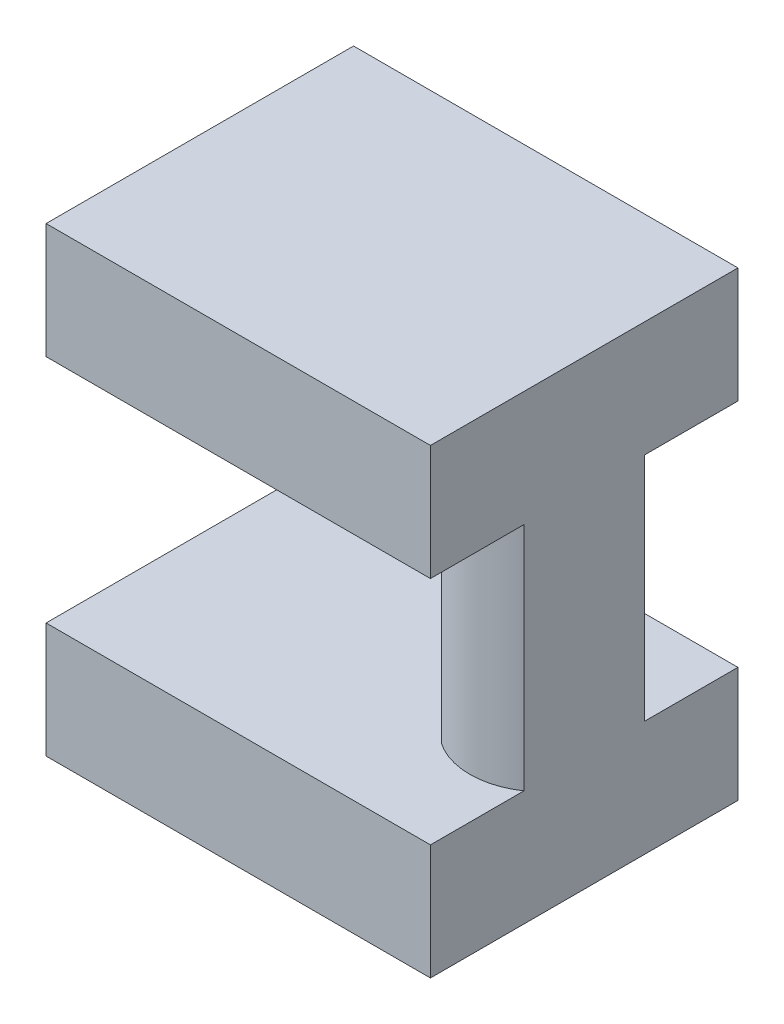
ISO-10303-21;
HEADER;
FILE_DESCRIPTION(('STEP AP214'),'2;1');
FILE_NAME('part.step','',(''),(''),'','','');
FILE_SCHEMA(('AUTOMOTIVE_DESIGN { 1 0 10303 214 1 1 1 1 }'));
ENDSEC;
DATA;
#1=APPLICATION_CONTEXT('core data for automotive mechanical design processes');
#2=APPLICATION_PROTOCOL_DEFINITION('international standard','automotive_design',2000,#1);
#3=PRODUCT_CONTEXT('',#1,'mechanical');
#4=PRODUCT('Part','Part','',(#3));
#5=PRODUCT_RELATED_PRODUCT_CATEGORY('part','',(#4));
#6=PRODUCT_DEFINITION_FORMATION('','',#4);
#7=PRODUCT_DEFINITION_CONTEXT('part definition',#1,'design');
#8=PRODUCT_DEFINITION('design','',#6,#7);
#9=PRODUCT_DEFINITION_SHAPE('','',#8);
#10=(LENGTH_UNIT() NAMED_UNIT(*) SI_UNIT(.MILLI.,.METRE.));
#11=(NAMED_UNIT(*) PLANE_ANGLE_UNIT() SI_UNIT($,.RADIAN.));
#12=(NAMED_UNIT(*) SI_UNIT($,.STERADIAN.) SOLID_ANGLE_UNIT());
#13=UNCERTAINTY_MEASURE_WITH_UNIT(LENGTH_MEASURE(1.E-05),#10,'distance_accuracy_value','');
#14=(GEOMETRIC_REPRESENTATION_CONTEXT(3) GLOBAL_UNCERTAINTY_ASSIGNED_CONTEXT((#13)) GLOBAL_UNIT_ASSIGNED_CONTEXT((#10,
#11,#12)) REPRESENTATION_CONTEXT('',''));
#15=CARTESIAN_POINT('',(0.,0.,0.));
#16=DIRECTION('',(0.,0.,1.));
#17=DIRECTION('',(1.,0.,0.));
#18=AXIS2_PLACEMENT_3D('',#15,#16,#17);
#19=CARTESIAN_POINT('',(0.,3.,0.));
#20=DIRECTION('',(0.,0.,-1.));
#21=DIRECTION('',(-1.,0.,0.));
#22=AXIS2_PLACEMENT_3D('',#19,#20,#21);
#23=PLANE('',#22);
#24=DIRECTION('',(-1.,0.,0.));
#25=VECTOR('',#24,1.);
#26=CARTESIAN_POINT('',(0.,3.,0.));
#27=LINE('',#26,#25);
#28=CARTESIAN_POINT('',(10.,3.,0.));
#29=VERTEX_POINT('',#28);
#30=CARTESIAN_POINT('',(0.,3.,0.));
#31=VERTEX_POINT('',#30);
#32=EDGE_CURVE('E118',#29,#31,#27,.T.);
#33=ORIENTED_EDGE('',*,*,#32,.F.);
#34=DIRECTION('',(0.,1.,0.));
#35=VECTOR('',#34,1.);
#36=CARTESIAN_POINT('',(10.,0.,0.));
#37=LINE('',#36,#35);
#38=CARTESIAN_POINT('',(10.,0.,0.));
#39=VERTEX_POINT('',#38);
#40=EDGE_CURVE('E172',#39,#29,#37,.T.);
#41=ORIENTED_EDGE('',*,*,#40,.F.);
#42=DIRECTION('',(1.,0.,0.));
#43=VECTOR('',#42,1.);
#44=CARTESIAN_POINT('',(0.,0.,0.));
#45=LINE('',#44,#43);
#46=CARTESIAN_POINT('',(0.,0.,0.));
#47=VERTEX_POINT('',#46);
#48=EDGE_CURVE('E168',#47,#39,#45,.T.);
#49=ORIENTED_EDGE('',*,*,#48,.F.);
#50=DIRECTION('',(0.,-1.,0.));
#51=VECTOR('',#50,1.);
#52=CARTESIAN_POINT('',(0.,0.,0.));
#53=LINE('',#52,#51);
#54=EDGE_CURVE('E165',#31,#47,#53,.T.);
#55=ORIENTED_EDGE('',*,*,#54,.F.);
#56=EDGE_LOOP('',(#33,#41,#49,#55));
#57=FACE_BOUND('',#56,.T.);
#58=ADVANCED_FACE('F69',(#57),#23,.T.);
#59=CARTESIAN_POINT('',(0.,3.,8.));
#60=DIRECTION('',(0.,0.,-1.));
#61=DIRECTION('',(-1.,0.,0.));
#62=AXIS2_PLACEMENT_3D('',#59,#60,#61);
#63=PLANE('',#62);
#64=DIRECTION('',(1.,0.,0.));
#65=VECTOR('',#64,1.);
#66=CARTESIAN_POINT('',(0.,9.,8.));
#67=LINE('',#66,#65);
#68=CARTESIAN_POINT('',(0.,9.,8.));
#69=VERTEX_POINT('',#68);
#70=CARTESIAN_POINT('',(10.,9.,8.));
#71=VERTEX_POINT('',#70);
#72=EDGE_CURVE('E158',#69,#71,#67,.T.);
#73=ORIENTED_EDGE('',*,*,#72,.T.);
#74=DIRECTION('',(0.,1.,0.));
#75=VECTOR('',#74,1.);
#76=CARTESIAN_POINT('',(10.,0.,8.));
#77=LINE('',#76,#75);
#78=CARTESIAN_POINT('',(10.,12.,8.));
#79=VERTEX_POINT('',#78);
#80=EDGE_CURVE('E143',#71,#79,#77,.T.);
#81=ORIENTED_EDGE('',*,*,#80,.T.);
#82=DIRECTION('',(-1.,0.,0.));
#83=VECTOR('',#82,1.);
#84=CARTESIAN_POINT('',(0.,12.,8.));
#85=LINE('',#84,#83);
#86=CARTESIAN_POINT('',(0.,12.,8.));
#87=VERTEX_POINT('',#86);
#88=EDGE_CURVE('E136',#79,#87,#85,.T.);
#89=ORIENTED_EDGE('',*,*,#88,.T.);
#90=DIRECTION('',(0.,-1.,0.));
#91=VECTOR('',#90,1.);
#92=CARTESIAN_POINT('',(0.,9.,8.));
#93=LINE('',#92,#91);
#94=EDGE_CURVE('E141',#87,#69,#93,.T.);
#95=ORIENTED_EDGE('',*,*,#94,.T.);
#96=EDGE_LOOP('',(#73,#81,#89,#95));
#97=FACE_BOUND('',#96,.T.);
#98=ADVANCED_FACE('F139',(#97),#63,.F.);
#99=CARTESIAN_POINT('',(0.,0.,8.));
#100=DIRECTION('',(1.,0.,0.));
#101=DIRECTION('',(0.,1.,0.));
#102=AXIS2_PLACEMENT_3D('',#99,#100,#101);
#103=PLANE('',#102);
#104=ORIENTED_EDGE('',*,*,#54,.T.);
#105=DIRECTION('',(0.,0.,-1.));
#106=VECTOR('',#105,1.);
#107=CARTESIAN_POINT('',(0.,0.,8.));
#108=LINE('',#107,#106);
#109=CARTESIAN_POINT('',(0.,0.,8.));
#110=VERTEX_POINT('',#109);
#111=EDGE_CURVE('E12',#110,#47,#108,.T.);
#112=ORIENTED_EDGE('',*,*,#111,.F.);
#113=DIRECTION('',(0.,-1.,0.));
#114=VECTOR('',#113,1.);
#115=CARTESIAN_POINT('',(0.,0.,8.));
#116=LINE('',#115,#114);
#117=CARTESIAN_POINT('',(0.,3.,8.));
#118=VERTEX_POINT('',#117);
#119=EDGE_CURVE('E181',#118,#110,#116,.T.);
#120=ORIENTED_EDGE('',*,*,#119,.F.);
#121=DIRECTION('',(0.,0.,-1.));
#122=VECTOR('',#121,1.);
#123=CARTESIAN_POINT('',(0.,3.,8.));
#124=LINE('',#123,#122);
#125=EDGE_CURVE('E164',#118,#31,#124,.T.);
#126=ORIENTED_EDGE('',*,*,#125,.T.);
#127=EDGE_LOOP('',(#104,#112,#120,#126));
#128=FACE_BOUND('',#127,.T.);
#129=ADVANCED_FACE('F71',(#128),#103,.F.);
#130=CARTESIAN_POINT('',(0.,0.,8.));
#131=DIRECTION('',(0.,1.,0.));
#132=DIRECTION('',(0.,0.,1.));
#133=AXIS2_PLACEMENT_3D('',#130,#131,#132);
#134=PLANE('',#133);
#135=ORIENTED_EDGE('',*,*,#48,.T.);
#136=DIRECTION('',(0.,0.,-1.));
#137=VECTOR('',#136,1.);
#138=CARTESIAN_POINT('',(10.,0.,8.));
#139=LINE('',#138,#137);
#140=CARTESIAN_POINT('',(10.,0.,8.));
#141=VERTEX_POINT('',#140);
#142=EDGE_CURVE('E78',#141,#39,#139,.T.);
#143=ORIENTED_EDGE('',*,*,#142,.F.);
#144=DIRECTION('',(1.,0.,0.));
#145=VECTOR('',#144,1.);
#146=CARTESIAN_POINT('',(0.,0.,8.));
#147=LINE('',#146,#145);
#148=EDGE_CURVE('E126',#110,#141,#147,.T.);
#149=ORIENTED_EDGE('',*,*,#148,.F.);
#150=ORIENTED_EDGE('',*,*,#111,.T.);
#151=EDGE_LOOP('',(#135,#143,#149,#150));
#152=FACE_BOUND('',#151,.T.);
#153=ADVANCED_FACE('F298',(#152),#134,.F.);
#154=CARTESIAN_POINT('',(10.,0.,8.));
#155=DIRECTION('',(-1.,0.,0.));
#156=DIRECTION('',(0.,0.,1.));
#157=AXIS2_PLACEMENT_3D('',#154,#155,#156);
#158=PLANE('',#157);
#159=DIRECTION('',(0.,0.,1.));
#160=VECTOR('',#159,1.);
#161=CARTESIAN_POINT('',(10.,9.,8.));
#162=LINE('',#161,#160);
#163=CARTESIAN_POINT('',(10.,9.,5.56664450338933));
#164=VERTEX_POINT('',#163);
#165=EDGE_CURVE('E169',#164,#71,#162,.T.);
#166=ORIENTED_EDGE('',*,*,#165,.F.);
#167=DIRECTION('',(0.,-1.,0.));
#168=VECTOR('',#167,1.);
#169=CARTESIAN_POINT('',(10.,10.1255002830389,5.56664450338933));
#170=LINE('',#169,#168);
#171=CARTESIAN_POINT('',(10.,3.,5.56664450338933));
#172=VERTEX_POINT('',#171);
#173=EDGE_CURVE('E248',#164,#172,#170,.T.);
#174=ORIENTED_EDGE('',*,*,#173,.T.);
#175=DIRECTION('',(0.,0.,-1.));
#176=VECTOR('',#175,1.);
#177=CARTESIAN_POINT('',(10.,3.,8.));
#178=LINE('',#177,#176);
#179=CARTESIAN_POINT('',(10.,3.,8.));
#180=VERTEX_POINT('',#179);
#181=EDGE_CURVE('E213',#180,#172,#178,.T.);
#182=ORIENTED_EDGE('',*,*,#181,.F.);
#183=EDGE_CURVE('E147',#141,#180,#77,.T.);
#184=ORIENTED_EDGE('',*,*,#183,.F.);
#185=ORIENTED_EDGE('',*,*,#142,.T.);
#186=ORIENTED_EDGE('',*,*,#40,.T.);
#187=DIRECTION('',(0.,0.,-1.));
#188=VECTOR('',#187,1.);
#189=CARTESIAN_POINT('',(10.,3.,0.));
#190=LINE('',#189,#188);
#191=CARTESIAN_POINT('',(10.,3.,2.43335549661067));
#192=VERTEX_POINT('',#191);
#193=EDGE_CURVE('E205',#192,#29,#190,.T.);
#194=ORIENTED_EDGE('',*,*,#193,.F.);
#195=DIRECTION('',(0.,-1.,0.));
#196=VECTOR('',#195,1.);
#197=CARTESIAN_POINT('',(10.,10.1255002830389,2.43335549661067));
#198=LINE('',#197,#196);
#199=CARTESIAN_POINT('',(10.,9.,2.43335549661067));
#200=VERTEX_POINT('',#199);
#201=EDGE_CURVE('E256',#200,#192,#198,.T.);
#202=ORIENTED_EDGE('',*,*,#201,.F.);
#203=DIRECTION('',(0.,0.,1.));
#204=VECTOR('',#203,1.);
#205=CARTESIAN_POINT('',(10.,9.,0.));
#206=LINE('',#205,#204);
#207=CARTESIAN_POINT('',(10.,9.,0.));
#208=VERTEX_POINT('',#207);
#209=EDGE_CURVE('E214',#208,#200,#206,.T.);
#210=ORIENTED_EDGE('',*,*,#209,.F.);
#211=CARTESIAN_POINT('',(10.,12.,0.));
#212=VERTEX_POINT('',#211);
#213=EDGE_CURVE('E171',#208,#212,#37,.T.);
#214=ORIENTED_EDGE('',*,*,#213,.T.);
#215=DIRECTION('',(0.,0.,-1.));
#216=VECTOR('',#215,1.);
#217=CARTESIAN_POINT('',(10.,12.,8.));
#218=LINE('',#217,#216);
#219=EDGE_CURVE('E153',#79,#212,#218,.T.);
#220=ORIENTED_EDGE('',*,*,#219,.F.);
#221=ORIENTED_EDGE('',*,*,#80,.F.);
#222=EDGE_LOOP('',(#166,#174,#182,#184,#185,#186,#194,#202,#210,#214,#220,#221));
#223=FACE_BOUND('',#222,.T.);
#224=ADVANCED_FACE('F195',(#223),#158,.F.);
#225=CARTESIAN_POINT('',(0.,12.,8.));
#226=DIRECTION('',(0.,-1.,0.));
#227=DIRECTION('',(0.,0.,-1.));
#228=AXIS2_PLACEMENT_3D('',#225,#226,#227);
#229=PLANE('',#228);
#230=DIRECTION('',(-1.,0.,0.));
#231=VECTOR('',#230,1.);
#232=CARTESIAN_POINT('',(0.,12.,0.));
#233=LINE('',#232,#231);
#234=CARTESIAN_POINT('',(0.,12.,0.));
#235=VERTEX_POINT('',#234);
#236=EDGE_CURVE('E152',#212,#235,#233,.T.);
#237=ORIENTED_EDGE('',*,*,#236,.T.);
#238=DIRECTION('',(0.,0.,-1.));
#239=VECTOR('',#238,1.);
#240=CARTESIAN_POINT('',(0.,12.,8.));
#241=LINE('',#240,#239);
#242=EDGE_CURVE('E149',#87,#235,#241,.T.);
#243=ORIENTED_EDGE('',*,*,#242,.F.);
#244=ORIENTED_EDGE('',*,*,#88,.F.);
#245=ORIENTED_EDGE('',*,*,#219,.T.);
#246=EDGE_LOOP('',(#237,#243,#244,#245));
#247=FACE_BOUND('',#246,.T.);
#248=ADVANCED_FACE('F150',(#247),#229,.F.);
#249=CARTESIAN_POINT('',(0.,9.,8.));
#250=DIRECTION('',(1.,0.,0.));
#251=DIRECTION('',(0.,1.,0.));
#252=AXIS2_PLACEMENT_3D('',#249,#250,#251);
#253=PLANE('',#252);
#254=DIRECTION('',(0.,-1.,0.));
#255=VECTOR('',#254,1.);
#256=CARTESIAN_POINT('',(0.,9.,0.));
#257=LINE('',#256,#255);
#258=CARTESIAN_POINT('',(0.,9.,0.));
#259=VERTEX_POINT('',#258);
#260=EDGE_CURVE('E111',#235,#259,#257,.T.);
#261=ORIENTED_EDGE('',*,*,#260,.T.);
#262=DIRECTION('',(0.,0.,-1.));
#263=VECTOR('',#262,1.);
#264=CARTESIAN_POINT('',(0.,9.,8.));
#265=LINE('',#264,#263);
#266=EDGE_CURVE('E154',#69,#259,#265,.T.);
#267=ORIENTED_EDGE('',*,*,#266,.F.);
#268=ORIENTED_EDGE('',*,*,#94,.F.);
#269=ORIENTED_EDGE('',*,*,#242,.T.);
#270=EDGE_LOOP('',(#261,#267,#268,#269));
#271=FACE_BOUND('',#270,.T.);
#272=ADVANCED_FACE('F156',(#271),#253,.F.);
#273=CARTESIAN_POINT('',(0.,9.,8.));
#274=DIRECTION('',(0.,1.,0.));
#275=DIRECTION('',(0.,0.,1.));
#276=AXIS2_PLACEMENT_3D('',#273,#274,#275);
#277=PLANE('',#276);
#278=DIRECTION('',(0.,0.,-1.));
#279=VECTOR('',#278,1.);
#280=CARTESIAN_POINT('',(7.85,9.,8.));
#281=LINE('',#280,#279);
#282=CARTESIAN_POINT('',(7.85,9.,5.56664450338933));
#283=VERTEX_POINT('',#282);
#284=CARTESIAN_POINT('',(7.85,9.,2.43335549661067));
#285=VERTEX_POINT('',#284);
#286=EDGE_CURVE('E186',#283,#285,#281,.T.);
#287=ORIENTED_EDGE('',*,*,#286,.F.);
#288=CARTESIAN_POINT('',(8.925,9.,4.));
#289=DIRECTION('',(0.,1.,0.));
#290=DIRECTION('',(0.,0.,1.));
#291=AXIS2_PLACEMENT_3D('',#288,#289,#290);
#292=CIRCLE('',#291,1.9);
#293=EDGE_CURVE('E251',#283,#164,#292,.T.);
#294=ORIENTED_EDGE('',*,*,#293,.T.);
#295=ORIENTED_EDGE('',*,*,#165,.T.);
#296=ORIENTED_EDGE('',*,*,#72,.F.);
#297=ORIENTED_EDGE('',*,*,#266,.T.);
#298=DIRECTION('',(1.,0.,0.));
#299=VECTOR('',#298,1.);
#300=CARTESIAN_POINT('',(0.,9.,0.));
#301=LINE('',#300,#299);
#302=EDGE_CURVE('E177',#259,#208,#301,.T.);
#303=ORIENTED_EDGE('',*,*,#302,.T.);
#304=ORIENTED_EDGE('',*,*,#209,.T.);
#305=CARTESIAN_POINT('',(8.925,9.,4.));
#306=DIRECTION('',(0.,1.,0.));
#307=DIRECTION('',(0.,0.,1.));
#308=AXIS2_PLACEMENT_3D('',#305,#306,#307);
#309=CIRCLE('',#308,1.9);
#310=EDGE_CURVE('E268',#200,#285,#309,.T.);
#311=ORIENTED_EDGE('',*,*,#310,.T.);
#312=EDGE_LOOP('',(#287,#294,#295,#296,#297,#303,#304,#311));
#313=FACE_BOUND('',#312,.T.);
#314=ADVANCED_FACE('F252',(#313),#277,.F.);
#315=CARTESIAN_POINT('',(7.85,9.,8.));
#316=DIRECTION('',(1.,0.,0.));
#317=DIRECTION('',(0.,0.,-1.));
#318=AXIS2_PLACEMENT_3D('',#315,#316,#317);
#319=PLANE('',#318);
#320=DIRECTION('',(0.,0.,-1.));
#321=VECTOR('',#320,1.);
#322=CARTESIAN_POINT('',(7.85,3.,8.));
#323=LINE('',#322,#321);
#324=CARTESIAN_POINT('',(7.85,3.,5.56664450338933));
#325=VERTEX_POINT('',#324);
#326=CARTESIAN_POINT('',(7.85,3.,2.43335549661067));
#327=VERTEX_POINT('',#326);
#328=EDGE_CURVE('E183',#325,#327,#323,.T.);
#329=ORIENTED_EDGE('',*,*,#328,.F.);
#330=DIRECTION('',(0.,-1.,0.));
#331=VECTOR('',#330,1.);
#332=CARTESIAN_POINT('',(7.85,10.1255002830389,5.56664450338933));
#333=LINE('',#332,#331);
#334=EDGE_CURVE('E257',#283,#325,#333,.T.);
#335=ORIENTED_EDGE('',*,*,#334,.F.);
#336=ORIENTED_EDGE('',*,*,#286,.T.);
#337=DIRECTION('',(0.,-1.,0.));
#338=VECTOR('',#337,1.);
#339=CARTESIAN_POINT('',(7.85,10.1255002830389,2.43335549661067));
#340=LINE('',#339,#338);
#341=EDGE_CURVE('E219',#285,#327,#340,.T.);
#342=ORIENTED_EDGE('',*,*,#341,.T.);
#343=EDGE_LOOP('',(#329,#335,#336,#342));
#344=FACE_BOUND('',#343,.T.);
#345=ADVANCED_FACE('F273',(#344),#319,.F.);
#346=CARTESIAN_POINT('',(0.,3.,8.));
#347=DIRECTION('',(0.,-1.,0.));
#348=DIRECTION('',(0.,0.,-1.));
#349=AXIS2_PLACEMENT_3D('',#346,#347,#348);
#350=PLANE('',#349);
#351=CARTESIAN_POINT('',(8.925,3.,4.));
#352=DIRECTION('',(0.,1.,0.));
#353=DIRECTION('',(0.,0.,1.));
#354=AXIS2_PLACEMENT_3D('',#351,#352,#353);
#355=CIRCLE('',#354,1.9);
#356=EDGE_CURVE('E261',#325,#172,#355,.T.);
#357=ORIENTED_EDGE('',*,*,#356,.F.);
#358=ORIENTED_EDGE('',*,*,#328,.T.);
#359=CARTESIAN_POINT('',(8.925,3.,4.));
#360=DIRECTION('',(0.,1.,0.));
#361=DIRECTION('',(0.,0.,1.));
#362=AXIS2_PLACEMENT_3D('',#359,#360,#361);
#363=CIRCLE('',#362,1.9);
#364=EDGE_CURVE('E210',#192,#327,#363,.T.);
#365=ORIENTED_EDGE('',*,*,#364,.F.);
#366=ORIENTED_EDGE('',*,*,#193,.T.);
#367=ORIENTED_EDGE('',*,*,#32,.T.);
#368=ORIENTED_EDGE('',*,*,#125,.F.);
#369=DIRECTION('',(-1.,0.,0.));
#370=VECTOR('',#369,1.);
#371=CARTESIAN_POINT('',(0.,3.,8.));
#372=LINE('',#371,#370);
#373=EDGE_CURVE('E86',#180,#118,#372,.T.);
#374=ORIENTED_EDGE('',*,*,#373,.F.);
#375=ORIENTED_EDGE('',*,*,#181,.T.);
#376=EDGE_LOOP('',(#357,#358,#365,#366,#367,#368,#374,#375));
#377=FACE_BOUND('',#376,.T.);
#378=ADVANCED_FACE('F207',(#377),#350,.F.);
#379=ORIENTED_EDGE('',*,*,#183,.T.);
#380=ORIENTED_EDGE('',*,*,#373,.T.);
#381=ORIENTED_EDGE('',*,*,#119,.T.);
#382=ORIENTED_EDGE('',*,*,#148,.T.);
#383=EDGE_LOOP('',(#379,#380,#381,#382));
#384=FACE_BOUND('',#383,.T.);
#385=ADVANCED_FACE('F226',(#384),#63,.F.);
#386=ORIENTED_EDGE('',*,*,#213,.F.);
#387=ORIENTED_EDGE('',*,*,#302,.F.);
#388=ORIENTED_EDGE('',*,*,#260,.F.);
#389=ORIENTED_EDGE('',*,*,#236,.F.);
#390=EDGE_LOOP('',(#386,#387,#388,#389));
#391=FACE_BOUND('',#390,.T.);
#392=ADVANCED_FACE('F281',(#391),#23,.T.);
#393=CARTESIAN_POINT('',(8.925,10.1255002830389,4.));
#394=DIRECTION('',(0.,-1.,0.));
#395=DIRECTION('',(0.,0.,-1.));
#396=AXIS2_PLACEMENT_3D('',#393,#394,#395);
#397=CYLINDRICAL_SURFACE('',#396,1.9);
#398=ORIENTED_EDGE('',*,*,#310,.F.);
#399=ORIENTED_EDGE('',*,*,#201,.T.);
#400=ORIENTED_EDGE('',*,*,#364,.T.);
#401=ORIENTED_EDGE('',*,*,#341,.F.);
#402=EDGE_LOOP('',(#398,#399,#400,#401));
#403=FACE_BOUND('',#402,.T.);
#404=ADVANCED_FACE('F276',(#403),#397,.T.);
#405=CARTESIAN_POINT('',(8.925,10.1255002830389,4.));
#406=DIRECTION('',(0.,-1.,0.));
#407=DIRECTION('',(0.,0.,-1.));
#408=AXIS2_PLACEMENT_3D('',#405,#406,#407);
#409=CYLINDRICAL_SURFACE('',#408,1.9);
#410=ORIENTED_EDGE('',*,*,#334,.T.);
#411=ORIENTED_EDGE('',*,*,#356,.T.);
#412=ORIENTED_EDGE('',*,*,#173,.F.);
#413=ORIENTED_EDGE('',*,*,#293,.F.);
#414=EDGE_LOOP('',(#410,#411,#412,#413));
#415=FACE_BOUND('',#414,.T.);
#416=ADVANCED_FACE('F260',(#415),#409,.T.);
#417=CLOSED_SHELL('',(#58,#98,#129,#153,#224,#248,#272,#314,#345,#378,#385,#392,#404,#416));
#418=MANIFOLD_SOLID_BREP('B2',#417);
#419=ADVANCED_BREP_SHAPE_REPRESENTATION('',(#18,#418),#14);
#420=SHAPE_DEFINITION_REPRESENTATION(#9,#419);
ENDSEC;
END-ISO-10303-21;
